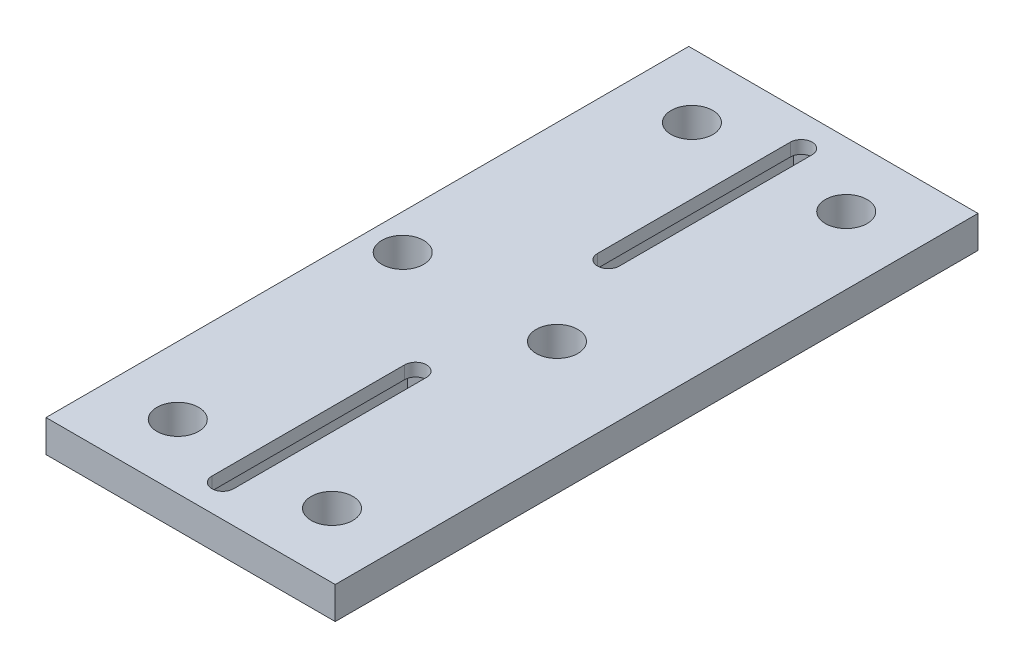
ISO-10303-21;
HEADER;
FILE_DESCRIPTION(('STEP AP214'),'2;1');
FILE_NAME('part.step','',(''),(''),'','','');
FILE_SCHEMA(('AUTOMOTIVE_DESIGN { 1 0 10303 214 1 1 1 1 }'));
ENDSEC;
DATA;
#1=APPLICATION_CONTEXT('core data for automotive mechanical design processes');
#2=APPLICATION_PROTOCOL_DEFINITION('international standard','automotive_design',2000,#1);
#3=PRODUCT_CONTEXT('',#1,'mechanical');
#4=PRODUCT('Part','Part','',(#3));
#5=PRODUCT_RELATED_PRODUCT_CATEGORY('part','',(#4));
#6=PRODUCT_DEFINITION_FORMATION('','',#4);
#7=PRODUCT_DEFINITION_CONTEXT('part definition',#1,'design');
#8=PRODUCT_DEFINITION('design','',#6,#7);
#9=PRODUCT_DEFINITION_SHAPE('','',#8);
#10=(LENGTH_UNIT() NAMED_UNIT(*) SI_UNIT(.MILLI.,.METRE.));
#11=(NAMED_UNIT(*) PLANE_ANGLE_UNIT() SI_UNIT($,.RADIAN.));
#12=(NAMED_UNIT(*) SI_UNIT($,.STERADIAN.) SOLID_ANGLE_UNIT());
#13=UNCERTAINTY_MEASURE_WITH_UNIT(LENGTH_MEASURE(1.E-05),#10,'distance_accuracy_value','');
#14=(GEOMETRIC_REPRESENTATION_CONTEXT(3) GLOBAL_UNCERTAINTY_ASSIGNED_CONTEXT((#13)) GLOBAL_UNIT_ASSIGNED_CONTEXT((#10,
#11,#12)) REPRESENTATION_CONTEXT('',''));
#15=CARTESIAN_POINT('',(0.,0.,0.));
#16=DIRECTION('',(0.,0.,1.));
#17=DIRECTION('',(1.,0.,0.));
#18=AXIS2_PLACEMENT_3D('',#15,#16,#17);
#19=CARTESIAN_POINT('',(0.,0.,0.));
#20=DIRECTION('',(0.,-1.,0.));
#21=DIRECTION('',(0.,0.,1.));
#22=AXIS2_PLACEMENT_3D('',#19,#20,#21);
#23=PLANE('',#22);
#24=DIRECTION('',(0.,0.,-1.));
#25=VECTOR('',#24,1.);
#26=CARTESIAN_POINT('',(-2.9,0.,0.));
#27=LINE('',#26,#25);
#28=CARTESIAN_POINT('',(-2.9,0.,46.6743157806499));
#29=VERTEX_POINT('',#28);
#30=CARTESIAN_POINT('',(-2.9,0.,13.3256842193501));
#31=VERTEX_POINT('',#30);
#32=EDGE_CURVE('E303',#29,#31,#27,.T.);
#33=ORIENTED_EDGE('',*,*,#32,.F.);
#34=DIRECTION('',(-0.866025403784438,0.,-0.500000000000001));
#35=VECTOR('',#34,1.);
#36=CARTESIAN_POINT('',(-20.9355715851499,0.,36.2614736709748));
#37=LINE('',#36,#35);
#38=CARTESIAN_POINT('',(0.,0.,48.3486315612998));
#39=VERTEX_POINT('',#38);
#40=EDGE_CURVE('E299',#39,#29,#37,.T.);
#41=ORIENTED_EDGE('',*,*,#40,.F.);
#42=DIRECTION('',(-0.866025403784437,0.,0.500000000000002));
#43=VECTOR('',#42,1.);
#44=CARTESIAN_POINT('',(20.9355715851499,0.,36.2614736709748));
#45=LINE('',#44,#43);
#46=CARTESIAN_POINT('',(2.9,0.,46.6743157806499));
#47=VERTEX_POINT('',#46);
#48=EDGE_CURVE('E295',#47,#39,#45,.T.);
#49=ORIENTED_EDGE('',*,*,#48,.F.);
#50=DIRECTION('',(0.,0.,1.));
#51=VECTOR('',#50,1.);
#52=CARTESIAN_POINT('',(2.90000000000001,0.,0.));
#53=LINE('',#52,#51);
#54=CARTESIAN_POINT('',(2.9,0.,13.3256842193501));
#55=VERTEX_POINT('',#54);
#56=EDGE_CURVE('E291',#55,#47,#53,.T.);
#57=ORIENTED_EDGE('',*,*,#56,.F.);
#58=DIRECTION('',(0.866025403784439,0.,0.5));
#59=VECTOR('',#58,1.);
#60=CARTESIAN_POINT('',(-5.04519052838329,0.,8.73852632902513));
#61=LINE('',#60,#59);
#62=CARTESIAN_POINT('',(0.,0.,11.6513684387002));
#63=VERTEX_POINT('',#62);
#64=EDGE_CURVE('E279',#63,#55,#61,.T.);
#65=ORIENTED_EDGE('',*,*,#64,.F.);
#66=DIRECTION('',(0.866025403784439,0.,-0.5));
#67=VECTOR('',#66,1.);
#68=CARTESIAN_POINT('',(5.04519052838329,0.,8.73852632902512));
#69=LINE('',#68,#67);
#70=EDGE_CURVE('E330',#31,#63,#69,.T.);
#71=ORIENTED_EDGE('',*,*,#70,.F.);
#72=EDGE_LOOP('',(#33,#41,#49,#57,#65,#71));
#73=FACE_BOUND('',#72,.T.);
#74=CARTESIAN_POINT('',(7.,0.,0.));
#75=DIRECTION('',(0.,-1.,0.));
#76=DIRECTION('',(0.,0.,-1.));
#77=AXIS2_PLACEMENT_3D('',#74,#75,#76);
#78=CIRCLE('',#77,3.25);
#79=CARTESIAN_POINT('',(7.,0.,-3.25));
#80=VERTEX_POINT('',#79);
#81=EDGE_CURVE('E399',#80,#80,#78,.T.);
#82=ORIENTED_EDGE('',*,*,#81,.F.);
#83=EDGE_LOOP('',(#82));
#84=FACE_BOUND('',#83,.T.);
#85=CARTESIAN_POINT('',(12.,0.,-40.));
#86=DIRECTION('',(0.,-1.,0.));
#87=DIRECTION('',(0.,0.,-1.));
#88=AXIS2_PLACEMENT_3D('',#85,#86,#87);
#89=CIRCLE('',#88,3.25);
#90=CARTESIAN_POINT('',(12.,0.,-43.25));
#91=VERTEX_POINT('',#90);
#92=EDGE_CURVE('E414',#91,#91,#89,.T.);
#93=ORIENTED_EDGE('',*,*,#92,.F.);
#94=EDGE_LOOP('',(#93));
#95=FACE_BOUND('',#94,.T.);
#96=CARTESIAN_POINT('',(-12.,0.,40.));
#97=DIRECTION('',(0.,-1.,0.));
#98=DIRECTION('',(0.,0.,-1.));
#99=AXIS2_PLACEMENT_3D('',#96,#97,#98);
#100=CIRCLE('',#99,3.25);
#101=CARTESIAN_POINT('',(-12.,0.,36.75));
#102=VERTEX_POINT('',#101);
#103=EDGE_CURVE('E430',#102,#102,#100,.T.);
#104=ORIENTED_EDGE('',*,*,#103,.F.);
#105=EDGE_LOOP('',(#104));
#106=FACE_BOUND('',#105,.T.);
#107=DIRECTION('',(0.,0.,1.));
#108=VECTOR('',#107,1.);
#109=CARTESIAN_POINT('',(22.5,0.,-50.));
#110=LINE('',#109,#108);
#111=CARTESIAN_POINT('',(22.5,0.,-50.));
#112=VERTEX_POINT('',#111);
#113=CARTESIAN_POINT('',(22.5,0.,50.));
#114=VERTEX_POINT('',#113);
#115=EDGE_CURVE('E438',#112,#114,#110,.T.);
#116=ORIENTED_EDGE('',*,*,#115,.T.);
#117=DIRECTION('',(-1.,0.,0.));
#118=VECTOR('',#117,1.);
#119=CARTESIAN_POINT('',(-22.5,0.,50.));
#120=LINE('',#119,#118);
#121=CARTESIAN_POINT('',(-22.5,0.,50.));
#122=VERTEX_POINT('',#121);
#123=EDGE_CURVE('E463',#114,#122,#120,.T.);
#124=ORIENTED_EDGE('',*,*,#123,.T.);
#125=DIRECTION('',(0.,0.,-1.));
#126=VECTOR('',#125,1.);
#127=CARTESIAN_POINT('',(-22.5,0.,-50.));
#128=LINE('',#127,#126);
#129=CARTESIAN_POINT('',(-22.5,0.,-50.));
#130=VERTEX_POINT('',#129);
#131=EDGE_CURVE('E467',#122,#130,#128,.T.);
#132=ORIENTED_EDGE('',*,*,#131,.T.);
#133=DIRECTION('',(1.,0.,0.));
#134=VECTOR('',#133,1.);
#135=CARTESIAN_POINT('',(-22.5,0.,-50.));
#136=LINE('',#135,#134);
#137=EDGE_CURVE('E447',#130,#112,#136,.T.);
#138=ORIENTED_EDGE('',*,*,#137,.T.);
#139=EDGE_LOOP('',(#116,#124,#132,#138));
#140=FACE_BOUND('',#139,.T.);
#141=CARTESIAN_POINT('',(12.,0.,40.));
#142=DIRECTION('',(0.,-1.,0.));
#143=DIRECTION('',(0.,0.,-1.));
#144=AXIS2_PLACEMENT_3D('',#141,#142,#143);
#145=CIRCLE('',#144,3.25);
#146=CARTESIAN_POINT('',(12.,0.,36.75));
#147=VERTEX_POINT('',#146);
#148=EDGE_CURVE('E422',#147,#147,#145,.T.);
#149=ORIENTED_EDGE('',*,*,#148,.F.);
#150=EDGE_LOOP('',(#149));
#151=FACE_BOUND('',#150,.T.);
#152=CARTESIAN_POINT('',(-12.,0.,-40.));
#153=DIRECTION('',(0.,-1.,0.));
#154=DIRECTION('',(0.,0.,-1.));
#155=AXIS2_PLACEMENT_3D('',#152,#153,#154);
#156=CIRCLE('',#155,3.25);
#157=CARTESIAN_POINT('',(-12.,0.,-43.25));
#158=VERTEX_POINT('',#157);
#159=EDGE_CURVE('E406',#158,#158,#156,.T.);
#160=ORIENTED_EDGE('',*,*,#159,.F.);
#161=EDGE_LOOP('',(#160));
#162=FACE_BOUND('',#161,.T.);
#163=CARTESIAN_POINT('',(-17.,0.,0.));
#164=DIRECTION('',(0.,-1.,0.));
#165=DIRECTION('',(0.,0.,-1.));
#166=AXIS2_PLACEMENT_3D('',#163,#164,#165);
#167=CIRCLE('',#166,3.25);
#168=CARTESIAN_POINT('',(-17.,0.,-3.25));
#169=VERTEX_POINT('',#168);
#170=EDGE_CURVE('E386',#169,#169,#167,.T.);
#171=ORIENTED_EDGE('',*,*,#170,.F.);
#172=EDGE_LOOP('',(#171));
#173=FACE_BOUND('',#172,.T.);
#174=DIRECTION('',(0.866025403784439,0.,0.5));
#175=VECTOR('',#174,1.);
#176=CARTESIAN_POINT('',(5.04519052838329,0.,-8.73852632902512));
#177=LINE('',#176,#175);
#178=CARTESIAN_POINT('',(-2.9,0.,-13.3256842193501));
#179=VERTEX_POINT('',#178);
#180=CARTESIAN_POINT('',(0.,0.,-11.6513684387002));
#181=VERTEX_POINT('',#180);
#182=EDGE_CURVE('E234',#179,#181,#177,.T.);
#183=ORIENTED_EDGE('',*,*,#182,.T.);
#184=DIRECTION('',(0.866025403784439,0.,-0.5));
#185=VECTOR('',#184,1.);
#186=CARTESIAN_POINT('',(-5.04519052838329,0.,-8.73852632902513));
#187=LINE('',#186,#185);
#188=CARTESIAN_POINT('',(2.9,0.,-13.3256842193501));
#189=VERTEX_POINT('',#188);
#190=EDGE_CURVE('E659',#181,#189,#187,.T.);
#191=ORIENTED_EDGE('',*,*,#190,.T.);
#192=DIRECTION('',(0.,0.,-1.));
#193=VECTOR('',#192,1.);
#194=CARTESIAN_POINT('',(2.90000000000001,0.,0.));
#195=LINE('',#194,#193);
#196=CARTESIAN_POINT('',(2.9,0.,-46.6743157806499));
#197=VERTEX_POINT('',#196);
#198=EDGE_CURVE('E656',#189,#197,#195,.T.);
#199=ORIENTED_EDGE('',*,*,#198,.T.);
#200=DIRECTION('',(-0.866025403784437,0.,-0.500000000000002));
#201=VECTOR('',#200,1.);
#202=CARTESIAN_POINT('',(20.9355715851499,0.,-36.2614736709748));
#203=LINE('',#202,#201);
#204=CARTESIAN_POINT('',(0.,0.,-48.3486315612998));
#205=VERTEX_POINT('',#204);
#206=EDGE_CURVE('E237',#197,#205,#203,.T.);
#207=ORIENTED_EDGE('',*,*,#206,.T.);
#208=DIRECTION('',(-0.866025403784438,0.,0.500000000000001));
#209=VECTOR('',#208,1.);
#210=CARTESIAN_POINT('',(-20.9355715851499,0.,-36.2614736709748));
#211=LINE('',#210,#209);
#212=CARTESIAN_POINT('',(-2.9,0.,-46.6743157806499));
#213=VERTEX_POINT('',#212);
#214=EDGE_CURVE('E215',#205,#213,#211,.T.);
#215=ORIENTED_EDGE('',*,*,#214,.T.);
#216=DIRECTION('',(0.,0.,1.));
#217=VECTOR('',#216,1.);
#218=CARTESIAN_POINT('',(-2.9,0.,0.));
#219=LINE('',#218,#217);
#220=EDGE_CURVE('E225',#213,#179,#219,.T.);
#221=ORIENTED_EDGE('',*,*,#220,.T.);
#222=EDGE_LOOP('',(#183,#191,#199,#207,#215,#221));
#223=FACE_BOUND('',#222,.T.);
#224=ADVANCED_FACE('F47',(#73,#84,#95,#106,#140,#151,#162,#173,#223),#23,.T.);
#225=CARTESIAN_POINT('',(0.,5.,0.));
#226=DIRECTION('',(0.,-1.,0.));
#227=DIRECTION('',(0.,0.,1.));
#228=AXIS2_PLACEMENT_3D('',#225,#226,#227);
#229=PLANE('',#228);
#230=CARTESIAN_POINT('',(-17.,5.,0.));
#231=DIRECTION('',(0.,-1.,0.));
#232=DIRECTION('',(0.,0.,-1.));
#233=AXIS2_PLACEMENT_3D('',#230,#231,#232);
#234=CIRCLE('',#233,3.25);
#235=CARTESIAN_POINT('',(-17.,5.,-3.25));
#236=VERTEX_POINT('',#235);
#237=EDGE_CURVE('E395',#236,#236,#234,.T.);
#238=ORIENTED_EDGE('',*,*,#237,.T.);
#239=EDGE_LOOP('',(#238));
#240=FACE_BOUND('',#239,.T.);
#241=CARTESIAN_POINT('',(7.,5.,0.));
#242=DIRECTION('',(0.,-1.,0.));
#243=DIRECTION('',(0.,0.,-1.));
#244=AXIS2_PLACEMENT_3D('',#241,#242,#243);
#245=CIRCLE('',#244,3.25);
#246=CARTESIAN_POINT('',(7.,5.,-3.25));
#247=VERTEX_POINT('',#246);
#248=EDGE_CURVE('E402',#247,#247,#245,.T.);
#249=ORIENTED_EDGE('',*,*,#248,.T.);
#250=EDGE_LOOP('',(#249));
#251=FACE_BOUND('',#250,.T.);
#252=CARTESIAN_POINT('',(-12.,5.,-40.));
#253=DIRECTION('',(0.,-1.,0.));
#254=DIRECTION('',(0.,0.,-1.));
#255=AXIS2_PLACEMENT_3D('',#252,#253,#254);
#256=CIRCLE('',#255,3.25);
#257=CARTESIAN_POINT('',(-12.,5.,-43.25));
#258=VERTEX_POINT('',#257);
#259=EDGE_CURVE('E410',#258,#258,#256,.T.);
#260=ORIENTED_EDGE('',*,*,#259,.T.);
#261=EDGE_LOOP('',(#260));
#262=FACE_BOUND('',#261,.T.);
#263=CARTESIAN_POINT('',(12.,5.,-40.));
#264=DIRECTION('',(0.,-1.,0.));
#265=DIRECTION('',(0.,0.,-1.));
#266=AXIS2_PLACEMENT_3D('',#263,#264,#265);
#267=CIRCLE('',#266,3.25);
#268=CARTESIAN_POINT('',(12.,5.,-43.25));
#269=VERTEX_POINT('',#268);
#270=EDGE_CURVE('E418',#269,#269,#267,.T.);
#271=ORIENTED_EDGE('',*,*,#270,.T.);
#272=EDGE_LOOP('',(#271));
#273=FACE_BOUND('',#272,.T.);
#274=CARTESIAN_POINT('',(12.,5.,40.));
#275=DIRECTION('',(0.,-1.,0.));
#276=DIRECTION('',(0.,0.,-1.));
#277=AXIS2_PLACEMENT_3D('',#274,#275,#276);
#278=CIRCLE('',#277,3.25);
#279=CARTESIAN_POINT('',(12.,5.,36.75));
#280=VERTEX_POINT('',#279);
#281=EDGE_CURVE('E426',#280,#280,#278,.T.);
#282=ORIENTED_EDGE('',*,*,#281,.T.);
#283=EDGE_LOOP('',(#282));
#284=FACE_BOUND('',#283,.T.);
#285=CARTESIAN_POINT('',(-12.,5.,40.));
#286=DIRECTION('',(0.,-1.,0.));
#287=DIRECTION('',(0.,0.,-1.));
#288=AXIS2_PLACEMENT_3D('',#285,#286,#287);
#289=CIRCLE('',#288,3.25);
#290=CARTESIAN_POINT('',(-12.,5.,36.75));
#291=VERTEX_POINT('',#290);
#292=EDGE_CURVE('E434',#291,#291,#289,.T.);
#293=ORIENTED_EDGE('',*,*,#292,.T.);
#294=EDGE_LOOP('',(#293));
#295=FACE_BOUND('',#294,.T.);
#296=DIRECTION('',(0.,0.,1.));
#297=VECTOR('',#296,1.);
#298=CARTESIAN_POINT('',(22.5,5.,-50.));
#299=LINE('',#298,#297);
#300=CARTESIAN_POINT('',(22.5,5.,-50.));
#301=VERTEX_POINT('',#300);
#302=CARTESIAN_POINT('',(22.5,5.,50.));
#303=VERTEX_POINT('',#302);
#304=EDGE_CURVE('E442',#301,#303,#299,.T.);
#305=ORIENTED_EDGE('',*,*,#304,.F.);
#306=DIRECTION('',(1.,0.,0.));
#307=VECTOR('',#306,1.);
#308=CARTESIAN_POINT('',(-22.5,5.,-50.));
#309=LINE('',#308,#307);
#310=CARTESIAN_POINT('',(-22.5,5.,-50.));
#311=VERTEX_POINT('',#310);
#312=EDGE_CURVE('E455',#311,#301,#309,.T.);
#313=ORIENTED_EDGE('',*,*,#312,.F.);
#314=DIRECTION('',(0.,0.,-1.));
#315=VECTOR('',#314,1.);
#316=CARTESIAN_POINT('',(-22.5,5.,-50.));
#317=LINE('',#316,#315);
#318=CARTESIAN_POINT('',(-22.5,5.,50.));
#319=VERTEX_POINT('',#318);
#320=EDGE_CURVE('E451',#319,#311,#317,.T.);
#321=ORIENTED_EDGE('',*,*,#320,.F.);
#322=DIRECTION('',(-1.,0.,0.));
#323=VECTOR('',#322,1.);
#324=CARTESIAN_POINT('',(-22.5,5.,50.));
#325=LINE('',#324,#323);
#326=EDGE_CURVE('E446',#303,#319,#325,.T.);
#327=ORIENTED_EDGE('',*,*,#326,.F.);
#328=EDGE_LOOP('',(#305,#313,#321,#327));
#329=FACE_BOUND('',#328,.T.);
#330=DIRECTION('',(0.,0.,-1.));
#331=VECTOR('',#330,1.);
#332=CARTESIAN_POINT('',(-1.7,5.,45.));
#333=LINE('',#332,#331);
#334=CARTESIAN_POINT('',(-1.7,5.,45.));
#335=VERTEX_POINT('',#334);
#336=CARTESIAN_POINT('',(-1.7,5.,15.));
#337=VERTEX_POINT('',#336);
#338=EDGE_CURVE('E372',#335,#337,#333,.T.);
#339=ORIENTED_EDGE('',*,*,#338,.T.);
#340=CARTESIAN_POINT('',(0.,5.,15.));
#341=DIRECTION('',(0.,-1.,0.));
#342=DIRECTION('',(0.,0.,-1.));
#343=AXIS2_PLACEMENT_3D('',#340,#341,#342);
#344=CIRCLE('',#343,1.7);
#345=CARTESIAN_POINT('',(1.7,5.,15.));
#346=VERTEX_POINT('',#345);
#347=EDGE_CURVE('E376',#337,#346,#344,.T.);
#348=ORIENTED_EDGE('',*,*,#347,.T.);
#349=DIRECTION('',(0.,0.,1.));
#350=VECTOR('',#349,1.);
#351=CARTESIAN_POINT('',(1.7,5.,45.));
#352=LINE('',#351,#350);
#353=CARTESIAN_POINT('',(1.7,5.,45.));
#354=VERTEX_POINT('',#353);
#355=EDGE_CURVE('E359',#346,#354,#352,.T.);
#356=ORIENTED_EDGE('',*,*,#355,.T.);
#357=CARTESIAN_POINT('',(0.,5.,45.));
#358=DIRECTION('',(0.,-1.,0.));
#359=DIRECTION('',(0.,0.,-1.));
#360=AXIS2_PLACEMENT_3D('',#357,#358,#359);
#361=CIRCLE('',#360,1.7);
#362=EDGE_CURVE('E353',#354,#335,#361,.T.);
#363=ORIENTED_EDGE('',*,*,#362,.T.);
#364=EDGE_LOOP('',(#339,#348,#356,#363));
#365=FACE_BOUND('',#364,.T.);
#366=CARTESIAN_POINT('',(0.,5.,-45.));
#367=DIRECTION('',(0.,1.,0.));
#368=DIRECTION('',(0.,0.,1.));
#369=AXIS2_PLACEMENT_3D('',#366,#367,#368);
#370=CIRCLE('',#369,1.7);
#371=CARTESIAN_POINT('',(1.7,5.,-45.));
#372=VERTEX_POINT('',#371);
#373=CARTESIAN_POINT('',(-1.7,5.,-45.));
#374=VERTEX_POINT('',#373);
#375=EDGE_CURVE('E239',#372,#374,#370,.T.);
#376=ORIENTED_EDGE('',*,*,#375,.F.);
#377=DIRECTION('',(0.,0.,-1.));
#378=VECTOR('',#377,1.);
#379=CARTESIAN_POINT('',(1.7,5.,-45.));
#380=LINE('',#379,#378);
#381=CARTESIAN_POINT('',(1.7,5.,-15.));
#382=VERTEX_POINT('',#381);
#383=EDGE_CURVE('E244',#382,#372,#380,.T.);
#384=ORIENTED_EDGE('',*,*,#383,.F.);
#385=CARTESIAN_POINT('',(0.,5.,-15.));
#386=DIRECTION('',(0.,1.,0.));
#387=DIRECTION('',(0.,0.,1.));
#388=AXIS2_PLACEMENT_3D('',#385,#386,#387);
#389=CIRCLE('',#388,1.7);
#390=CARTESIAN_POINT('',(-1.7,5.,-15.));
#391=VERTEX_POINT('',#390);
#392=EDGE_CURVE('E269',#391,#382,#389,.T.);
#393=ORIENTED_EDGE('',*,*,#392,.F.);
#394=DIRECTION('',(0.,0.,1.));
#395=VECTOR('',#394,1.);
#396=CARTESIAN_POINT('',(-1.7,5.,-45.));
#397=LINE('',#396,#395);
#398=EDGE_CURVE('E256',#374,#391,#397,.T.);
#399=ORIENTED_EDGE('',*,*,#398,.F.);
#400=EDGE_LOOP('',(#376,#384,#393,#399));
#401=FACE_BOUND('',#400,.T.);
#402=ADVANCED_FACE('F494',(#240,#251,#262,#273,#284,#295,#329,#365,#401),#229,.F.);
#403=CARTESIAN_POINT('',(22.5,5.,-50.));
#404=DIRECTION('',(-1.,0.,0.));
#405=DIRECTION('',(0.,0.,-1.));
#406=AXIS2_PLACEMENT_3D('',#403,#404,#405);
#407=PLANE('',#406);
#408=ORIENTED_EDGE('',*,*,#115,.F.);
#409=DIRECTION('',(0.,-1.,0.));
#410=VECTOR('',#409,1.);
#411=CARTESIAN_POINT('',(22.5,5.,-50.));
#412=LINE('',#411,#410);
#413=EDGE_CURVE('E459',#301,#112,#412,.T.);
#414=ORIENTED_EDGE('',*,*,#413,.F.);
#415=ORIENTED_EDGE('',*,*,#304,.T.);
#416=DIRECTION('',(0.,-1.,0.));
#417=VECTOR('',#416,1.);
#418=CARTESIAN_POINT('',(22.5,5.,50.));
#419=LINE('',#418,#417);
#420=EDGE_CURVE('E11',#303,#114,#419,.T.);
#421=ORIENTED_EDGE('',*,*,#420,.T.);
#422=EDGE_LOOP('',(#408,#414,#415,#421));
#423=FACE_BOUND('',#422,.T.);
#424=ADVANCED_FACE('F49',(#423),#407,.F.);
#425=CARTESIAN_POINT('',(-22.5,5.,50.));
#426=DIRECTION('',(0.,0.,-1.));
#427=DIRECTION('',(1.,0.,0.));
#428=AXIS2_PLACEMENT_3D('',#425,#426,#427);
#429=PLANE('',#428);
#430=ORIENTED_EDGE('',*,*,#123,.F.);
#431=ORIENTED_EDGE('',*,*,#420,.F.);
#432=ORIENTED_EDGE('',*,*,#326,.T.);
#433=DIRECTION('',(0.,-1.,0.));
#434=VECTOR('',#433,1.);
#435=CARTESIAN_POINT('',(-22.5,5.,50.));
#436=LINE('',#435,#434);
#437=EDGE_CURVE('E56',#319,#122,#436,.T.);
#438=ORIENTED_EDGE('',*,*,#437,.T.);
#439=EDGE_LOOP('',(#430,#431,#432,#438));
#440=FACE_BOUND('',#439,.T.);
#441=ADVANCED_FACE('F482',(#440),#429,.F.);
#442=CARTESIAN_POINT('',(-22.5,5.,-50.));
#443=DIRECTION('',(1.,0.,0.));
#444=DIRECTION('',(0.,0.,1.));
#445=AXIS2_PLACEMENT_3D('',#442,#443,#444);
#446=PLANE('',#445);
#447=ORIENTED_EDGE('',*,*,#131,.F.);
#448=ORIENTED_EDGE('',*,*,#437,.F.);
#449=ORIENTED_EDGE('',*,*,#320,.T.);
#450=DIRECTION('',(0.,-1.,0.));
#451=VECTOR('',#450,1.);
#452=CARTESIAN_POINT('',(-22.5,5.,-50.));
#453=LINE('',#452,#451);
#454=EDGE_CURVE('E476',#311,#130,#453,.T.);
#455=ORIENTED_EDGE('',*,*,#454,.T.);
#456=EDGE_LOOP('',(#447,#448,#449,#455));
#457=FACE_BOUND('',#456,.T.);
#458=ADVANCED_FACE('F486',(#457),#446,.F.);
#459=CARTESIAN_POINT('',(-22.5,5.,-50.));
#460=DIRECTION('',(0.,0.,1.));
#461=DIRECTION('',(-1.,0.,0.));
#462=AXIS2_PLACEMENT_3D('',#459,#460,#461);
#463=PLANE('',#462);
#464=ORIENTED_EDGE('',*,*,#137,.F.);
#465=ORIENTED_EDGE('',*,*,#454,.F.);
#466=ORIENTED_EDGE('',*,*,#312,.T.);
#467=ORIENTED_EDGE('',*,*,#413,.T.);
#468=EDGE_LOOP('',(#464,#465,#466,#467));
#469=FACE_BOUND('',#468,.T.);
#470=ADVANCED_FACE('F498',(#469),#463,.F.);
#471=CARTESIAN_POINT('',(-12.,5.,40.));
#472=DIRECTION('',(0.,-1.,0.));
#473=DIRECTION('',(0.,0.,1.));
#474=AXIS2_PLACEMENT_3D('',#471,#472,#473);
#475=CYLINDRICAL_SURFACE('',#474,3.25);
#476=ORIENTED_EDGE('',*,*,#292,.F.);
#477=EDGE_LOOP('',(#476));
#478=FACE_BOUND('',#477,.T.);
#479=ORIENTED_EDGE('',*,*,#103,.T.);
#480=EDGE_LOOP('',(#479));
#481=FACE_BOUND('',#480,.T.);
#482=ADVANCED_FACE('F500',(#478,#481),#475,.F.);
#483=CARTESIAN_POINT('',(12.,5.,40.));
#484=DIRECTION('',(0.,-1.,0.));
#485=DIRECTION('',(0.,0.,1.));
#486=AXIS2_PLACEMENT_3D('',#483,#484,#485);
#487=CYLINDRICAL_SURFACE('',#486,3.25);
#488=ORIENTED_EDGE('',*,*,#281,.F.);
#489=EDGE_LOOP('',(#488));
#490=FACE_BOUND('',#489,.T.);
#491=ORIENTED_EDGE('',*,*,#148,.T.);
#492=EDGE_LOOP('',(#491));
#493=FACE_BOUND('',#492,.T.);
#494=ADVANCED_FACE('F506',(#490,#493),#487,.F.);
#495=CARTESIAN_POINT('',(12.,5.,-40.));
#496=DIRECTION('',(0.,-1.,0.));
#497=DIRECTION('',(0.,0.,1.));
#498=AXIS2_PLACEMENT_3D('',#495,#496,#497);
#499=CYLINDRICAL_SURFACE('',#498,3.25);
#500=ORIENTED_EDGE('',*,*,#270,.F.);
#501=EDGE_LOOP('',(#500));
#502=FACE_BOUND('',#501,.T.);
#503=ORIENTED_EDGE('',*,*,#92,.T.);
#504=EDGE_LOOP('',(#503));
#505=FACE_BOUND('',#504,.T.);
#506=ADVANCED_FACE('F523',(#502,#505),#499,.F.);
#507=CARTESIAN_POINT('',(-12.,5.,-40.));
#508=DIRECTION('',(0.,-1.,0.));
#509=DIRECTION('',(0.,0.,1.));
#510=AXIS2_PLACEMENT_3D('',#507,#508,#509);
#511=CYLINDRICAL_SURFACE('',#510,3.25);
#512=ORIENTED_EDGE('',*,*,#259,.F.);
#513=EDGE_LOOP('',(#512));
#514=FACE_BOUND('',#513,.T.);
#515=ORIENTED_EDGE('',*,*,#159,.T.);
#516=EDGE_LOOP('',(#515));
#517=FACE_BOUND('',#516,.T.);
#518=ADVANCED_FACE('F527',(#514,#517),#511,.F.);
#519=CARTESIAN_POINT('',(7.,5.,0.));
#520=DIRECTION('',(0.,-1.,0.));
#521=DIRECTION('',(0.,0.,1.));
#522=AXIS2_PLACEMENT_3D('',#519,#520,#521);
#523=CYLINDRICAL_SURFACE('',#522,3.25);
#524=ORIENTED_EDGE('',*,*,#248,.F.);
#525=EDGE_LOOP('',(#524));
#526=FACE_BOUND('',#525,.T.);
#527=ORIENTED_EDGE('',*,*,#81,.T.);
#528=EDGE_LOOP('',(#527));
#529=FACE_BOUND('',#528,.T.);
#530=ADVANCED_FACE('F531',(#526,#529),#523,.F.);
#531=CARTESIAN_POINT('',(-17.,5.,0.));
#532=DIRECTION('',(0.,-1.,0.));
#533=DIRECTION('',(0.,0.,1.));
#534=AXIS2_PLACEMENT_3D('',#531,#532,#533);
#535=CYLINDRICAL_SURFACE('',#534,3.25);
#536=ORIENTED_EDGE('',*,*,#237,.F.);
#537=EDGE_LOOP('',(#536));
#538=FACE_BOUND('',#537,.T.);
#539=ORIENTED_EDGE('',*,*,#170,.T.);
#540=EDGE_LOOP('',(#539));
#541=FACE_BOUND('',#540,.T.);
#542=ADVANCED_FACE('F535',(#538,#541),#535,.F.);
#543=CARTESIAN_POINT('',(0.,3.,45.));
#544=DIRECTION('',(0.,1.,0.));
#545=DIRECTION('',(0.,0.,-1.));
#546=AXIS2_PLACEMENT_3D('',#543,#544,#545);
#547=CYLINDRICAL_SURFACE('',#546,1.7);
#548=ORIENTED_EDGE('',*,*,#362,.F.);
#549=DIRECTION('',(0.,1.,0.));
#550=VECTOR('',#549,1.);
#551=CARTESIAN_POINT('',(1.7,3.,45.));
#552=LINE('',#551,#550);
#553=CARTESIAN_POINT('',(1.7,3.,45.));
#554=VERTEX_POINT('',#553);
#555=EDGE_CURVE('E383',#554,#354,#552,.T.);
#556=ORIENTED_EDGE('',*,*,#555,.F.);
#557=CARTESIAN_POINT('',(0.,3.,45.));
#558=DIRECTION('',(0.,-1.,0.));
#559=DIRECTION('',(0.,0.,-1.));
#560=AXIS2_PLACEMENT_3D('',#557,#558,#559);
#561=CIRCLE('',#560,1.7);
#562=CARTESIAN_POINT('',(-1.7,3.,45.));
#563=VERTEX_POINT('',#562);
#564=EDGE_CURVE('E354',#554,#563,#561,.T.);
#565=ORIENTED_EDGE('',*,*,#564,.T.);
#566=DIRECTION('',(0.,1.,0.));
#567=VECTOR('',#566,1.);
#568=CARTESIAN_POINT('',(-1.7,3.,45.));
#569=LINE('',#568,#567);
#570=EDGE_CURVE('E368',#563,#335,#569,.T.);
#571=ORIENTED_EDGE('',*,*,#570,.T.);
#572=EDGE_LOOP('',(#548,#556,#565,#571));
#573=FACE_BOUND('',#572,.T.);
#574=ADVANCED_FACE('F539',(#573),#547,.F.);
#575=CARTESIAN_POINT('',(1.7,3.,45.));
#576=DIRECTION('',(1.,0.,0.));
#577=DIRECTION('',(0.,0.,1.));
#578=AXIS2_PLACEMENT_3D('',#575,#576,#577);
#579=PLANE('',#578);
#580=ORIENTED_EDGE('',*,*,#355,.F.);
#581=DIRECTION('',(0.,1.,0.));
#582=VECTOR('',#581,1.);
#583=CARTESIAN_POINT('',(1.7,3.,15.));
#584=LINE('',#583,#582);
#585=CARTESIAN_POINT('',(1.7,3.,15.));
#586=VERTEX_POINT('',#585);
#587=EDGE_CURVE('E387',#586,#346,#584,.T.);
#588=ORIENTED_EDGE('',*,*,#587,.F.);
#589=DIRECTION('',(0.,0.,1.));
#590=VECTOR('',#589,1.);
#591=CARTESIAN_POINT('',(1.7,3.,45.));
#592=LINE('',#591,#590);
#593=EDGE_CURVE('E365',#586,#554,#592,.T.);
#594=ORIENTED_EDGE('',*,*,#593,.T.);
#595=ORIENTED_EDGE('',*,*,#555,.T.);
#596=EDGE_LOOP('',(#580,#588,#594,#595));
#597=FACE_BOUND('',#596,.T.);
#598=ADVANCED_FACE('F543',(#597),#579,.F.);
#599=CARTESIAN_POINT('',(0.,3.,15.));
#600=DIRECTION('',(0.,1.,0.));
#601=DIRECTION('',(0.,0.,-1.));
#602=AXIS2_PLACEMENT_3D('',#599,#600,#601);
#603=CYLINDRICAL_SURFACE('',#602,1.7);
#604=ORIENTED_EDGE('',*,*,#347,.F.);
#605=DIRECTION('',(0.,1.,0.));
#606=VECTOR('',#605,1.);
#607=CARTESIAN_POINT('',(-1.7,3.,15.));
#608=LINE('',#607,#606);
#609=CARTESIAN_POINT('',(-1.7,3.,15.));
#610=VERTEX_POINT('',#609);
#611=EDGE_CURVE('E390',#610,#337,#608,.T.);
#612=ORIENTED_EDGE('',*,*,#611,.F.);
#613=CARTESIAN_POINT('',(0.,3.,15.));
#614=DIRECTION('',(0.,-1.,0.));
#615=DIRECTION('',(0.,0.,-1.));
#616=AXIS2_PLACEMENT_3D('',#613,#614,#615);
#617=CIRCLE('',#616,1.7);
#618=EDGE_CURVE('E362',#610,#586,#617,.T.);
#619=ORIENTED_EDGE('',*,*,#618,.T.);
#620=ORIENTED_EDGE('',*,*,#587,.T.);
#621=EDGE_LOOP('',(#604,#612,#619,#620));
#622=FACE_BOUND('',#621,.T.);
#623=ADVANCED_FACE('F549',(#622),#603,.F.);
#624=CARTESIAN_POINT('',(-1.7,3.,45.));
#625=DIRECTION('',(-1.,0.,0.));
#626=DIRECTION('',(0.,0.,-1.));
#627=AXIS2_PLACEMENT_3D('',#624,#625,#626);
#628=PLANE('',#627);
#629=ORIENTED_EDGE('',*,*,#338,.F.);
#630=ORIENTED_EDGE('',*,*,#570,.F.);
#631=DIRECTION('',(0.,0.,-1.));
#632=VECTOR('',#631,1.);
#633=CARTESIAN_POINT('',(-1.7,3.,45.));
#634=LINE('',#633,#632);
#635=EDGE_CURVE('E358',#563,#610,#634,.T.);
#636=ORIENTED_EDGE('',*,*,#635,.T.);
#637=ORIENTED_EDGE('',*,*,#611,.T.);
#638=EDGE_LOOP('',(#629,#630,#636,#637));
#639=FACE_BOUND('',#638,.T.);
#640=ADVANCED_FACE('F545',(#639),#628,.F.);
#641=CARTESIAN_POINT('',(-2.9,-0.00100000000000013,0.));
#642=DIRECTION('',(-1.,0.,0.));
#643=DIRECTION('',(0.,0.,-1.));
#644=AXIS2_PLACEMENT_3D('',#641,#642,#643);
#645=PLANE('',#644);
#646=DIRECTION('',(0.,1.,0.));
#647=VECTOR('',#646,1.);
#648=CARTESIAN_POINT('',(-2.9,-0.00100000000000013,46.6743157806499));
#649=LINE('',#648,#647);
#650=CARTESIAN_POINT('',(-2.9,3.,46.6743157806499));
#651=VERTEX_POINT('',#650);
#652=EDGE_CURVE('E326',#29,#651,#649,.T.);
#653=ORIENTED_EDGE('',*,*,#652,.F.);
#654=ORIENTED_EDGE('',*,*,#32,.T.);
#655=DIRECTION('',(0.,1.,0.));
#656=VECTOR('',#655,1.);
#657=CARTESIAN_POINT('',(-2.9,-0.00100000000000013,13.3256842193501));
#658=LINE('',#657,#656);
#659=CARTESIAN_POINT('',(-2.9,3.,13.3256842193501));
#660=VERTEX_POINT('',#659);
#661=EDGE_CURVE('E325',#31,#660,#658,.T.);
#662=ORIENTED_EDGE('',*,*,#661,.T.);
#663=DIRECTION('',(0.,0.,-1.));
#664=VECTOR('',#663,1.);
#665=CARTESIAN_POINT('',(-2.9,3.,0.));
#666=LINE('',#665,#664);
#667=EDGE_CURVE('E307',#651,#660,#666,.T.);
#668=ORIENTED_EDGE('',*,*,#667,.F.);
#669=EDGE_LOOP('',(#653,#654,#662,#668));
#670=FACE_BOUND('',#669,.T.);
#671=ADVANCED_FACE('F548',(#670),#645,.F.);
#672=CARTESIAN_POINT('',(-20.9355715851499,-0.00100000000000013,36.2614736709748));
#673=DIRECTION('',(-0.500000000000001,0.,0.866025403784438));
#674=DIRECTION('',(-0.866025403784438,0.,-0.500000000000001));
#675=AXIS2_PLACEMENT_3D('',#672,#673,#674);
#676=PLANE('',#675);
#677=DIRECTION('',(0.,1.,0.));
#678=VECTOR('',#677,1.);
#679=CARTESIAN_POINT('',(0.,-0.00100000000000013,48.3486315612998));
#680=LINE('',#679,#678);
#681=CARTESIAN_POINT('',(0.,3.,48.3486315612998));
#682=VERTEX_POINT('',#681);
#683=EDGE_CURVE('E331',#39,#682,#680,.T.);
#684=ORIENTED_EDGE('',*,*,#683,.F.);
#685=ORIENTED_EDGE('',*,*,#40,.T.);
#686=ORIENTED_EDGE('',*,*,#652,.T.);
#687=DIRECTION('',(-0.866025403784438,0.,-0.500000000000001));
#688=VECTOR('',#687,1.);
#689=CARTESIAN_POINT('',(-20.9355715851499,3.,36.2614736709748));
#690=LINE('',#689,#688);
#691=EDGE_CURVE('E322',#682,#651,#690,.T.);
#692=ORIENTED_EDGE('',*,*,#691,.F.);
#693=EDGE_LOOP('',(#684,#685,#686,#692));
#694=FACE_BOUND('',#693,.T.);
#695=ADVANCED_FACE('F559',(#694),#676,.F.);
#696=CARTESIAN_POINT('',(20.9355715851499,-0.00100000000000013,36.2614736709748));
#697=DIRECTION('',(0.500000000000002,0.,0.866025403784437));
#698=DIRECTION('',(-0.866025403784437,0.,0.500000000000002));
#699=AXIS2_PLACEMENT_3D('',#696,#697,#698);
#700=PLANE('',#699);
#701=DIRECTION('',(0.,1.,0.));
#702=VECTOR('',#701,1.);
#703=CARTESIAN_POINT('',(2.9,-0.00100000000000013,46.6743157806499));
#704=LINE('',#703,#702);
#705=CARTESIAN_POINT('',(2.9,3.,46.6743157806499));
#706=VERTEX_POINT('',#705);
#707=EDGE_CURVE('E335',#47,#706,#704,.T.);
#708=ORIENTED_EDGE('',*,*,#707,.F.);
#709=ORIENTED_EDGE('',*,*,#48,.T.);
#710=ORIENTED_EDGE('',*,*,#683,.T.);
#711=DIRECTION('',(-0.866025403784437,0.,0.500000000000002));
#712=VECTOR('',#711,1.);
#713=CARTESIAN_POINT('',(20.9355715851499,3.,36.2614736709748));
#714=LINE('',#713,#712);
#715=EDGE_CURVE('E320',#706,#682,#714,.T.);
#716=ORIENTED_EDGE('',*,*,#715,.F.);
#717=EDGE_LOOP('',(#708,#709,#710,#716));
#718=FACE_BOUND('',#717,.T.);
#719=ADVANCED_FACE('F573',(#718),#700,.F.);
#720=CARTESIAN_POINT('',(2.90000000000001,-0.00100000000000013,0.));
#721=DIRECTION('',(1.,0.,0.));
#722=DIRECTION('',(0.,0.,1.));
#723=AXIS2_PLACEMENT_3D('',#720,#721,#722);
#724=PLANE('',#723);
#725=DIRECTION('',(0.,1.,0.));
#726=VECTOR('',#725,1.);
#727=CARTESIAN_POINT('',(2.9,-0.00100000000000013,13.3256842193501));
#728=LINE('',#727,#726);
#729=CARTESIAN_POINT('',(2.9,3.,13.3256842193501));
#730=VERTEX_POINT('',#729);
#731=EDGE_CURVE('E339',#55,#730,#728,.T.);
#732=ORIENTED_EDGE('',*,*,#731,.F.);
#733=ORIENTED_EDGE('',*,*,#56,.T.);
#734=ORIENTED_EDGE('',*,*,#707,.T.);
#735=DIRECTION('',(0.,0.,1.));
#736=VECTOR('',#735,1.);
#737=CARTESIAN_POINT('',(2.90000000000001,3.,0.));
#738=LINE('',#737,#736);
#739=EDGE_CURVE('E317',#730,#706,#738,.T.);
#740=ORIENTED_EDGE('',*,*,#739,.F.);
#741=EDGE_LOOP('',(#732,#733,#734,#740));
#742=FACE_BOUND('',#741,.T.);
#743=ADVANCED_FACE('F569',(#742),#724,.F.);
#744=CARTESIAN_POINT('',(-5.04519052838329,-0.00100000000000013,8.73852632902513));
#745=DIRECTION('',(0.5,0.,-0.866025403784438));
#746=DIRECTION('',(0.866025403784439,0.,0.5));
#747=AXIS2_PLACEMENT_3D('',#744,#745,#746);
#748=PLANE('',#747);
#749=DIRECTION('',(0.,1.,0.));
#750=VECTOR('',#749,1.);
#751=CARTESIAN_POINT('',(0.,-0.00100000000000013,11.6513684387002));
#752=LINE('',#751,#750);
#753=CARTESIAN_POINT('',(0.,3.,11.6513684387002));
#754=VERTEX_POINT('',#753);
#755=EDGE_CURVE('E343',#63,#754,#752,.T.);
#756=ORIENTED_EDGE('',*,*,#755,.F.);
#757=ORIENTED_EDGE('',*,*,#64,.T.);
#758=ORIENTED_EDGE('',*,*,#731,.T.);
#759=DIRECTION('',(0.866025403784439,0.,0.5));
#760=VECTOR('',#759,1.);
#761=CARTESIAN_POINT('',(-5.04519052838329,3.,8.73852632902513));
#762=LINE('',#761,#760);
#763=EDGE_CURVE('E314',#754,#730,#762,.T.);
#764=ORIENTED_EDGE('',*,*,#763,.F.);
#765=EDGE_LOOP('',(#756,#757,#758,#764));
#766=FACE_BOUND('',#765,.T.);
#767=ADVANCED_FACE('F565',(#766),#748,.F.);
#768=CARTESIAN_POINT('',(5.04519052838329,-0.00100000000000013,8.73852632902512));
#769=DIRECTION('',(-0.5,0.,-0.866025403784438));
#770=DIRECTION('',(0.866025403784439,0.,-0.5));
#771=AXIS2_PLACEMENT_3D('',#768,#769,#770);
#772=PLANE('',#771);
#773=ORIENTED_EDGE('',*,*,#661,.F.);
#774=ORIENTED_EDGE('',*,*,#70,.T.);
#775=ORIENTED_EDGE('',*,*,#755,.T.);
#776=DIRECTION('',(0.866025403784438,0.,-0.5));
#777=VECTOR('',#776,1.);
#778=CARTESIAN_POINT('',(5.04519052838329,3.,8.73852632902512));
#779=LINE('',#778,#777);
#780=EDGE_CURVE('E311',#660,#754,#779,.T.);
#781=ORIENTED_EDGE('',*,*,#780,.F.);
#782=EDGE_LOOP('',(#773,#774,#775,#781));
#783=FACE_BOUND('',#782,.T.);
#784=ADVANCED_FACE('F561',(#783),#772,.F.);
#785=CARTESIAN_POINT('',(0.,3.,0.));
#786=DIRECTION('',(0.,1.,0.));
#787=DIRECTION('',(0.,0.,-1.));
#788=AXIS2_PLACEMENT_3D('',#785,#786,#787);
#789=PLANE('',#788);
#790=ORIENTED_EDGE('',*,*,#564,.F.);
#791=ORIENTED_EDGE('',*,*,#593,.F.);
#792=ORIENTED_EDGE('',*,*,#618,.F.);
#793=ORIENTED_EDGE('',*,*,#635,.F.);
#794=EDGE_LOOP('',(#790,#791,#792,#793));
#795=FACE_BOUND('',#794,.T.);
#796=ORIENTED_EDGE('',*,*,#667,.T.);
#797=ORIENTED_EDGE('',*,*,#780,.T.);
#798=ORIENTED_EDGE('',*,*,#763,.T.);
#799=ORIENTED_EDGE('',*,*,#739,.T.);
#800=ORIENTED_EDGE('',*,*,#715,.T.);
#801=ORIENTED_EDGE('',*,*,#691,.T.);
#802=EDGE_LOOP('',(#796,#797,#798,#799,#800,#801));
#803=FACE_BOUND('',#802,.T.);
#804=ADVANCED_FACE('F564',(#795,#803),#789,.F.);
#805=CARTESIAN_POINT('',(0.,3.,-45.));
#806=DIRECTION('',(0.,1.,0.));
#807=DIRECTION('',(0.,0.,-1.));
#808=AXIS2_PLACEMENT_3D('',#805,#806,#807);
#809=CYLINDRICAL_SURFACE('',#808,1.7);
#810=ORIENTED_EDGE('',*,*,#375,.T.);
#811=DIRECTION('',(0.,1.,0.));
#812=VECTOR('',#811,1.);
#813=CARTESIAN_POINT('',(-1.7,3.,-45.));
#814=LINE('',#813,#812);
#815=CARTESIAN_POINT('',(-1.7,3.,-45.));
#816=VERTEX_POINT('',#815);
#817=EDGE_CURVE('E276',#816,#374,#814,.T.);
#818=ORIENTED_EDGE('',*,*,#817,.F.);
#819=CARTESIAN_POINT('',(0.,3.,-45.));
#820=DIRECTION('',(0.,1.,0.));
#821=DIRECTION('',(0.,0.,1.));
#822=AXIS2_PLACEMENT_3D('',#819,#820,#821);
#823=CIRCLE('',#822,1.7);
#824=CARTESIAN_POINT('',(1.7,3.,-45.));
#825=VERTEX_POINT('',#824);
#826=EDGE_CURVE('E251',#825,#816,#823,.T.);
#827=ORIENTED_EDGE('',*,*,#826,.F.);
#828=DIRECTION('',(0.,1.,0.));
#829=VECTOR('',#828,1.);
#830=CARTESIAN_POINT('',(1.7,3.,-45.));
#831=LINE('',#830,#829);
#832=EDGE_CURVE('E71',#825,#372,#831,.T.);
#833=ORIENTED_EDGE('',*,*,#832,.T.);
#834=EDGE_LOOP('',(#810,#818,#827,#833));
#835=FACE_BOUND('',#834,.T.);
#836=ADVANCED_FACE('F583',(#835),#809,.F.);
#837=CARTESIAN_POINT('',(-1.7,3.,-45.));
#838=DIRECTION('',(1.,0.,0.));
#839=DIRECTION('',(0.,0.,1.));
#840=AXIS2_PLACEMENT_3D('',#837,#838,#839);
#841=PLANE('',#840);
#842=ORIENTED_EDGE('',*,*,#398,.T.);
#843=DIRECTION('',(0.,1.,0.));
#844=VECTOR('',#843,1.);
#845=CARTESIAN_POINT('',(-1.7,3.,-15.));
#846=LINE('',#845,#844);
#847=CARTESIAN_POINT('',(-1.7,3.,-15.));
#848=VERTEX_POINT('',#847);
#849=EDGE_CURVE('E280',#848,#391,#846,.T.);
#850=ORIENTED_EDGE('',*,*,#849,.F.);
#851=DIRECTION('',(0.,0.,1.));
#852=VECTOR('',#851,1.);
#853=CARTESIAN_POINT('',(-1.7,3.,-45.));
#854=LINE('',#853,#852);
#855=EDGE_CURVE('E263',#816,#848,#854,.T.);
#856=ORIENTED_EDGE('',*,*,#855,.F.);
#857=ORIENTED_EDGE('',*,*,#817,.T.);
#858=EDGE_LOOP('',(#842,#850,#856,#857));
#859=FACE_BOUND('',#858,.T.);
#860=ADVANCED_FACE('F587',(#859),#841,.T.);
#861=CARTESIAN_POINT('',(0.,3.,-15.));
#862=DIRECTION('',(0.,1.,0.));
#863=DIRECTION('',(0.,0.,-1.));
#864=AXIS2_PLACEMENT_3D('',#861,#862,#863);
#865=CYLINDRICAL_SURFACE('',#864,1.7);
#866=ORIENTED_EDGE('',*,*,#392,.T.);
#867=DIRECTION('',(0.,1.,0.));
#868=VECTOR('',#867,1.);
#869=CARTESIAN_POINT('',(1.7,3.,-15.));
#870=LINE('',#869,#868);
#871=CARTESIAN_POINT('',(1.7,3.,-15.));
#872=VERTEX_POINT('',#871);
#873=EDGE_CURVE('E283',#872,#382,#870,.T.);
#874=ORIENTED_EDGE('',*,*,#873,.F.);
#875=CARTESIAN_POINT('',(0.,3.,-15.));
#876=DIRECTION('',(0.,1.,0.));
#877=DIRECTION('',(0.,0.,1.));
#878=AXIS2_PLACEMENT_3D('',#875,#876,#877);
#879=CIRCLE('',#878,1.7);
#880=EDGE_CURVE('E259',#848,#872,#879,.T.);
#881=ORIENTED_EDGE('',*,*,#880,.F.);
#882=ORIENTED_EDGE('',*,*,#849,.T.);
#883=EDGE_LOOP('',(#866,#874,#881,#882));
#884=FACE_BOUND('',#883,.T.);
#885=ADVANCED_FACE('F591',(#884),#865,.F.);
#886=CARTESIAN_POINT('',(1.7,3.,-45.));
#887=DIRECTION('',(-1.,0.,0.));
#888=DIRECTION('',(0.,0.,-1.));
#889=AXIS2_PLACEMENT_3D('',#886,#887,#888);
#890=PLANE('',#889);
#891=ORIENTED_EDGE('',*,*,#383,.T.);
#892=ORIENTED_EDGE('',*,*,#832,.F.);
#893=DIRECTION('',(0.,0.,-1.));
#894=VECTOR('',#893,1.);
#895=CARTESIAN_POINT('',(1.7,3.,-45.));
#896=LINE('',#895,#894);
#897=EDGE_CURVE('E255',#872,#825,#896,.T.);
#898=ORIENTED_EDGE('',*,*,#897,.F.);
#899=ORIENTED_EDGE('',*,*,#873,.T.);
#900=EDGE_LOOP('',(#891,#892,#898,#899));
#901=FACE_BOUND('',#900,.T.);
#902=ADVANCED_FACE('F588',(#901),#890,.T.);
#903=CARTESIAN_POINT('',(-2.9,-0.00100000000000013,0.));
#904=DIRECTION('',(1.,0.,0.));
#905=DIRECTION('',(0.,0.,1.));
#906=AXIS2_PLACEMENT_3D('',#903,#904,#905);
#907=PLANE('',#906);
#908=ORIENTED_EDGE('',*,*,#220,.F.);
#909=DIRECTION('',(0.,1.,0.));
#910=VECTOR('',#909,1.);
#911=CARTESIAN_POINT('',(-2.9,-0.00100000000000013,-46.6743157806499));
#912=LINE('',#911,#910);
#913=CARTESIAN_POINT('',(-2.9,3.,-46.6743157806499));
#914=VERTEX_POINT('',#913);
#915=EDGE_CURVE('E211',#213,#914,#912,.T.);
#916=ORIENTED_EDGE('',*,*,#915,.T.);
#917=DIRECTION('',(0.,0.,1.));
#918=VECTOR('',#917,1.);
#919=CARTESIAN_POINT('',(-2.9,3.,0.));
#920=LINE('',#919,#918);
#921=CARTESIAN_POINT('',(-2.9,3.,-13.3256842193501));
#922=VERTEX_POINT('',#921);
#923=EDGE_CURVE('E233',#914,#922,#920,.T.);
#924=ORIENTED_EDGE('',*,*,#923,.T.);
#925=DIRECTION('',(0.,1.,0.));
#926=VECTOR('',#925,1.);
#927=CARTESIAN_POINT('',(-2.9,-0.00100000000000013,-13.3256842193501));
#928=LINE('',#927,#926);
#929=EDGE_CURVE('E228',#179,#922,#928,.T.);
#930=ORIENTED_EDGE('',*,*,#929,.F.);
#931=EDGE_LOOP('',(#908,#916,#924,#930));
#932=FACE_BOUND('',#931,.T.);
#933=ADVANCED_FACE('F226',(#932),#907,.T.);
#934=CARTESIAN_POINT('',(5.04519052838329,-0.00100000000000013,-8.73852632902512));
#935=DIRECTION('',(0.5,0.,-0.866025403784438));
#936=DIRECTION('',(0.866025403784439,0.,0.5));
#937=AXIS2_PLACEMENT_3D('',#934,#935,#936);
#938=PLANE('',#937);
#939=ORIENTED_EDGE('',*,*,#182,.F.);
#940=ORIENTED_EDGE('',*,*,#929,.T.);
#941=DIRECTION('',(0.866025403784438,0.,0.5));
#942=VECTOR('',#941,1.);
#943=CARTESIAN_POINT('',(5.04519052838329,3.,-8.73852632902512));
#944=LINE('',#943,#942);
#945=CARTESIAN_POINT('',(0.,3.,-11.6513684387002));
#946=VERTEX_POINT('',#945);
#947=EDGE_CURVE('E222',#922,#946,#944,.T.);
#948=ORIENTED_EDGE('',*,*,#947,.T.);
#949=DIRECTION('',(0.,1.,0.));
#950=VECTOR('',#949,1.);
#951=CARTESIAN_POINT('',(0.,-0.00100000000000013,-11.6513684387002));
#952=LINE('',#951,#950);
#953=EDGE_CURVE('E247',#181,#946,#952,.T.);
#954=ORIENTED_EDGE('',*,*,#953,.F.);
#955=EDGE_LOOP('',(#939,#940,#948,#954));
#956=FACE_BOUND('',#955,.T.);
#957=ADVANCED_FACE('F601',(#956),#938,.T.);
#958=CARTESIAN_POINT('',(-5.04519052838329,-0.00100000000000013,-8.73852632902513));
#959=DIRECTION('',(-0.5,0.,-0.866025403784438));
#960=DIRECTION('',(0.866025403784439,0.,-0.5));
#961=AXIS2_PLACEMENT_3D('',#958,#959,#960);
#962=PLANE('',#961);
#963=ORIENTED_EDGE('',*,*,#190,.F.);
#964=ORIENTED_EDGE('',*,*,#953,.T.);
#965=DIRECTION('',(0.866025403784439,0.,-0.5));
#966=VECTOR('',#965,1.);
#967=CARTESIAN_POINT('',(-5.04519052838329,3.,-8.73852632902513));
#968=LINE('',#967,#966);
#969=CARTESIAN_POINT('',(2.9,3.,-13.3256842193501));
#970=VERTEX_POINT('',#969);
#971=EDGE_CURVE('E638',#946,#970,#968,.T.);
#972=ORIENTED_EDGE('',*,*,#971,.T.);
#973=DIRECTION('',(0.,1.,0.));
#974=VECTOR('',#973,1.);
#975=CARTESIAN_POINT('',(2.9,-0.00100000000000013,-13.3256842193501));
#976=LINE('',#975,#974);
#977=EDGE_CURVE('E647',#189,#970,#976,.T.);
#978=ORIENTED_EDGE('',*,*,#977,.F.);
#979=EDGE_LOOP('',(#963,#964,#972,#978));
#980=FACE_BOUND('',#979,.T.);
#981=ADVANCED_FACE('F611',(#980),#962,.T.);
#982=CARTESIAN_POINT('',(2.90000000000001,-0.00100000000000013,0.));
#983=DIRECTION('',(-1.,0.,0.));
#984=DIRECTION('',(0.,0.,-1.));
#985=AXIS2_PLACEMENT_3D('',#982,#983,#984);
#986=PLANE('',#985);
#987=ORIENTED_EDGE('',*,*,#198,.F.);
#988=ORIENTED_EDGE('',*,*,#977,.T.);
#989=DIRECTION('',(0.,0.,-1.));
#990=VECTOR('',#989,1.);
#991=CARTESIAN_POINT('',(2.90000000000001,3.,0.));
#992=LINE('',#991,#990);
#993=CARTESIAN_POINT('',(2.9,3.,-46.6743157806499));
#994=VERTEX_POINT('',#993);
#995=EDGE_CURVE('E634',#970,#994,#992,.T.);
#996=ORIENTED_EDGE('',*,*,#995,.T.);
#997=DIRECTION('',(0.,1.,0.));
#998=VECTOR('',#997,1.);
#999=CARTESIAN_POINT('',(2.9,-0.00100000000000013,-46.6743157806499));
#1000=LINE('',#999,#998);
#1001=EDGE_CURVE('E651',#197,#994,#1000,.T.);
#1002=ORIENTED_EDGE('',*,*,#1001,.F.);
#1003=EDGE_LOOP('',(#987,#988,#996,#1002));
#1004=FACE_BOUND('',#1003,.T.);
#1005=ADVANCED_FACE('F608',(#1004),#986,.T.);
#1006=CARTESIAN_POINT('',(20.9355715851499,-0.00100000000000013,-36.2614736709748));
#1007=DIRECTION('',(-0.500000000000002,0.,0.866025403784437));
#1008=DIRECTION('',(-0.866025403784437,0.,-0.500000000000002));
#1009=AXIS2_PLACEMENT_3D('',#1006,#1007,#1008);
#1010=PLANE('',#1009);
#1011=ORIENTED_EDGE('',*,*,#206,.F.);
#1012=ORIENTED_EDGE('',*,*,#1001,.T.);
#1013=DIRECTION('',(-0.866025403784437,0.,-0.500000000000002));
#1014=VECTOR('',#1013,1.);
#1015=CARTESIAN_POINT('',(20.9355715851499,3.,-36.2614736709748));
#1016=LINE('',#1015,#1014);
#1017=CARTESIAN_POINT('',(0.,3.,-48.3486315612998));
#1018=VERTEX_POINT('',#1017);
#1019=EDGE_CURVE('E628',#994,#1018,#1016,.T.);
#1020=ORIENTED_EDGE('',*,*,#1019,.T.);
#1021=DIRECTION('',(0.,1.,0.));
#1022=VECTOR('',#1021,1.);
#1023=CARTESIAN_POINT('',(0.,-0.00100000000000013,-48.3486315612998));
#1024=LINE('',#1023,#1022);
#1025=EDGE_CURVE('E63',#205,#1018,#1024,.T.);
#1026=ORIENTED_EDGE('',*,*,#1025,.F.);
#1027=EDGE_LOOP('',(#1011,#1012,#1020,#1026));
#1028=FACE_BOUND('',#1027,.T.);
#1029=ADVANCED_FACE('F605',(#1028),#1010,.T.);
#1030=CARTESIAN_POINT('',(-20.9355715851499,-0.00100000000000013,-36.2614736709748));
#1031=DIRECTION('',(0.500000000000001,0.,0.866025403784438));
#1032=DIRECTION('',(-0.866025403784438,0.,0.500000000000001));
#1033=AXIS2_PLACEMENT_3D('',#1030,#1031,#1032);
#1034=PLANE('',#1033);
#1035=ORIENTED_EDGE('',*,*,#214,.F.);
#1036=ORIENTED_EDGE('',*,*,#1025,.T.);
#1037=DIRECTION('',(-0.866025403784438,0.,0.500000000000001));
#1038=VECTOR('',#1037,1.);
#1039=CARTESIAN_POINT('',(-20.9355715851499,3.,-36.2614736709748));
#1040=LINE('',#1039,#1038);
#1041=EDGE_CURVE('E217',#1018,#914,#1040,.T.);
#1042=ORIENTED_EDGE('',*,*,#1041,.T.);
#1043=ORIENTED_EDGE('',*,*,#915,.F.);
#1044=EDGE_LOOP('',(#1035,#1036,#1042,#1043));
#1045=FACE_BOUND('',#1044,.T.);
#1046=ADVANCED_FACE('F213',(#1045),#1034,.T.);
#1047=CARTESIAN_POINT('',(0.,3.,0.));
#1048=DIRECTION('',(0.,1.,0.));
#1049=DIRECTION('',(0.,0.,1.));
#1050=AXIS2_PLACEMENT_3D('',#1047,#1048,#1049);
#1051=PLANE('',#1050);
#1052=ORIENTED_EDGE('',*,*,#897,.T.);
#1053=ORIENTED_EDGE('',*,*,#826,.T.);
#1054=ORIENTED_EDGE('',*,*,#855,.T.);
#1055=ORIENTED_EDGE('',*,*,#880,.T.);
#1056=EDGE_LOOP('',(#1052,#1053,#1054,#1055));
#1057=FACE_BOUND('',#1056,.T.);
#1058=ORIENTED_EDGE('',*,*,#923,.F.);
#1059=ORIENTED_EDGE('',*,*,#1041,.F.);
#1060=ORIENTED_EDGE('',*,*,#1019,.F.);
#1061=ORIENTED_EDGE('',*,*,#995,.F.);
#1062=ORIENTED_EDGE('',*,*,#971,.F.);
#1063=ORIENTED_EDGE('',*,*,#947,.F.);
#1064=EDGE_LOOP('',(#1058,#1059,#1060,#1061,#1062,#1063));
#1065=FACE_BOUND('',#1064,.T.);
#1066=ADVANCED_FACE('F604',(#1057,#1065),#1051,.F.);
#1067=CLOSED_SHELL('',(#224,#402,#424,#441,#458,#470,#482,#494,#506,#518,#530,#542,#574,#598,
#623,#640,#671,#695,#719,#743,#767,#784,#804,#836,#860,#885,#902,#933,#957,#981,#1005,#1029,
#1046,#1066));
#1068=MANIFOLD_SOLID_BREP('B2',#1067);
#1069=ADVANCED_BREP_SHAPE_REPRESENTATION('',(#18,#1068),#14);
#1070=SHAPE_DEFINITION_REPRESENTATION(#9,#1069);
ENDSEC;
END-ISO-10303-21;
